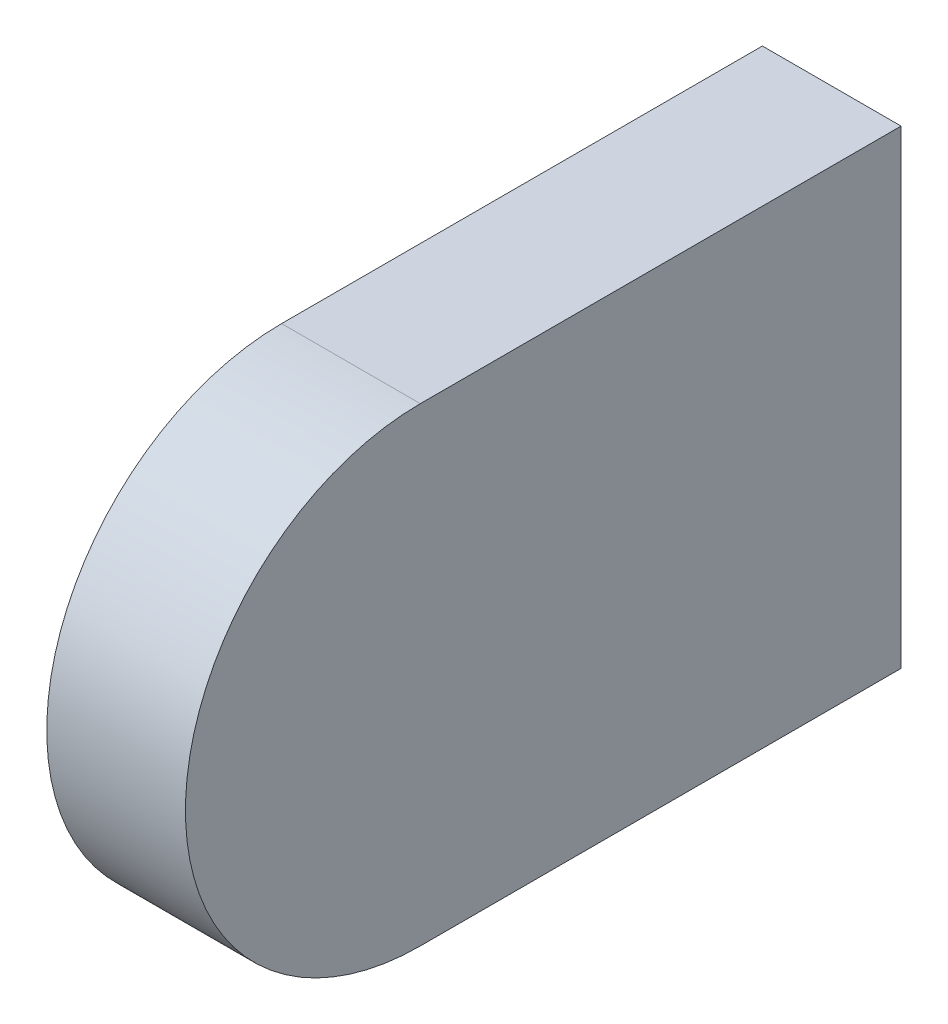
ISO-10303-21;
HEADER;
FILE_DESCRIPTION(('STEP AP214'),'2;1');
FILE_NAME('part.step','',(''),(''),'','','');
FILE_SCHEMA(('AUTOMOTIVE_DESIGN { 1 0 10303 214 1 1 1 1 }'));
ENDSEC;
DATA;
#1=APPLICATION_CONTEXT('core data for automotive mechanical design processes');
#2=APPLICATION_PROTOCOL_DEFINITION('international standard','automotive_design',2000,#1);
#3=PRODUCT_CONTEXT('',#1,'mechanical');
#4=PRODUCT('Part','Part','',(#3));
#5=PRODUCT_RELATED_PRODUCT_CATEGORY('part','',(#4));
#6=PRODUCT_DEFINITION_FORMATION('','',#4);
#7=PRODUCT_DEFINITION_CONTEXT('part definition',#1,'design');
#8=PRODUCT_DEFINITION('design','',#6,#7);
#9=PRODUCT_DEFINITION_SHAPE('','',#8);
#10=(LENGTH_UNIT() NAMED_UNIT(*) SI_UNIT(.MILLI.,.METRE.));
#11=(NAMED_UNIT(*) PLANE_ANGLE_UNIT() SI_UNIT($,.RADIAN.));
#12=(NAMED_UNIT(*) SI_UNIT($,.STERADIAN.) SOLID_ANGLE_UNIT());
#13=UNCERTAINTY_MEASURE_WITH_UNIT(LENGTH_MEASURE(1.E-05),#10,'distance_accuracy_value','');
#14=(GEOMETRIC_REPRESENTATION_CONTEXT(3) GLOBAL_UNCERTAINTY_ASSIGNED_CONTEXT((#13)) GLOBAL_UNIT_ASSIGNED_CONTEXT((#10,
#11,#12)) REPRESENTATION_CONTEXT('',''));
#15=CARTESIAN_POINT('',(0.,0.,0.));
#16=DIRECTION('',(0.,0.,1.));
#17=DIRECTION('',(1.,0.,0.));
#18=AXIS2_PLACEMENT_3D('',#15,#16,#17);
#19=CARTESIAN_POINT('',(75.,127.,0.));
#20=DIRECTION('',(0.,1.,0.));
#21=DIRECTION('',(0.,0.,1.));
#22=AXIS2_PLACEMENT_3D('',#19,#20,#21);
#23=PLANE('',#22);
#24=DIRECTION('',(0.,0.,-1.));
#25=VECTOR('',#24,1.);
#26=CARTESIAN_POINT('',(0.,127.,0.));
#27=LINE('',#26,#25);
#28=CARTESIAN_POINT('',(0.,127.,0.));
#29=VERTEX_POINT('',#28);
#30=CARTESIAN_POINT('',(0.,127.,-260.));
#31=VERTEX_POINT('',#30);
#32=EDGE_CURVE('E116',#29,#31,#27,.T.);
#33=ORIENTED_EDGE('',*,*,#32,.F.);
#34=DIRECTION('',(-1.,0.,0.));
#35=VECTOR('',#34,1.);
#36=CARTESIAN_POINT('',(75.,127.,0.));
#37=LINE('',#36,#35);
#38=CARTESIAN_POINT('',(75.,127.,0.));
#39=VERTEX_POINT('',#38);
#40=EDGE_CURVE('E11',#39,#29,#37,.T.);
#41=ORIENTED_EDGE('',*,*,#40,.F.);
#42=DIRECTION('',(0.,0.,-1.));
#43=VECTOR('',#42,1.);
#44=CARTESIAN_POINT('',(75.,127.,0.));
#45=LINE('',#44,#43);
#46=CARTESIAN_POINT('',(75.,127.,-260.));
#47=VERTEX_POINT('',#46);
#48=EDGE_CURVE('E109',#39,#47,#45,.T.);
#49=ORIENTED_EDGE('',*,*,#48,.T.);
#50=DIRECTION('',(-1.,0.,0.));
#51=VECTOR('',#50,1.);
#52=CARTESIAN_POINT('',(75.,127.,-260.));
#53=LINE('',#52,#51);
#54=EDGE_CURVE('E48',#47,#31,#53,.T.);
#55=ORIENTED_EDGE('',*,*,#54,.T.);
#56=EDGE_LOOP('',(#33,#41,#49,#55));
#57=FACE_BOUND('',#56,.T.);
#58=ADVANCED_FACE('F45',(#57),#23,.T.);
#59=CARTESIAN_POINT('',(75.,0.,0.));
#60=DIRECTION('',(-1.,0.,0.));
#61=DIRECTION('',(0.,0.,1.));
#62=AXIS2_PLACEMENT_3D('',#59,#60,#61);
#63=CYLINDRICAL_SURFACE('',#62,127.);
#64=CARTESIAN_POINT('',(0.,0.,0.));
#65=DIRECTION('',(1.,0.,0.));
#66=DIRECTION('',(0.,0.,-1.));
#67=AXIS2_PLACEMENT_3D('',#64,#65,#66);
#68=CIRCLE('',#67,127.);
#69=CARTESIAN_POINT('',(0.,-127.,0.));
#70=VERTEX_POINT('',#69);
#71=EDGE_CURVE('E79',#29,#70,#68,.T.);
#72=ORIENTED_EDGE('',*,*,#71,.T.);
#73=DIRECTION('',(-1.,0.,0.));
#74=VECTOR('',#73,1.);
#75=CARTESIAN_POINT('',(75.,-127.,0.));
#76=LINE('',#75,#74);
#77=CARTESIAN_POINT('',(75.,-127.,0.));
#78=VERTEX_POINT('',#77);
#79=EDGE_CURVE('E55',#78,#70,#76,.T.);
#80=ORIENTED_EDGE('',*,*,#79,.F.);
#81=CARTESIAN_POINT('',(75.,0.,0.));
#82=DIRECTION('',(1.,0.,0.));
#83=DIRECTION('',(0.,0.,-1.));
#84=AXIS2_PLACEMENT_3D('',#81,#82,#83);
#85=CIRCLE('',#84,127.);
#86=EDGE_CURVE('E94',#39,#78,#85,.T.);
#87=ORIENTED_EDGE('',*,*,#86,.F.);
#88=ORIENTED_EDGE('',*,*,#40,.T.);
#89=EDGE_LOOP('',(#72,#80,#87,#88));
#90=FACE_BOUND('',#89,.T.);
#91=ADVANCED_FACE('F132',(#90),#63,.T.);
#92=CARTESIAN_POINT('',(75.,-127.,0.));
#93=DIRECTION('',(0.,1.,0.));
#94=DIRECTION('',(0.,0.,1.));
#95=AXIS2_PLACEMENT_3D('',#92,#93,#94);
#96=PLANE('',#95);
#97=DIRECTION('',(0.,0.,-1.));
#98=VECTOR('',#97,1.);
#99=CARTESIAN_POINT('',(0.,-127.,0.));
#100=LINE('',#99,#98);
#101=CARTESIAN_POINT('',(0.,-127.,-260.));
#102=VERTEX_POINT('',#101);
#103=EDGE_CURVE('E102',#70,#102,#100,.T.);
#104=ORIENTED_EDGE('',*,*,#103,.T.);
#105=DIRECTION('',(-1.,0.,0.));
#106=VECTOR('',#105,1.);
#107=CARTESIAN_POINT('',(75.,-127.,-260.));
#108=LINE('',#107,#106);
#109=CARTESIAN_POINT('',(75.,-127.,-260.));
#110=VERTEX_POINT('',#109);
#111=EDGE_CURVE('E99',#110,#102,#108,.T.);
#112=ORIENTED_EDGE('',*,*,#111,.F.);
#113=DIRECTION('',(0.,0.,-1.));
#114=VECTOR('',#113,1.);
#115=CARTESIAN_POINT('',(75.,-127.,0.));
#116=LINE('',#115,#114);
#117=EDGE_CURVE('E91',#78,#110,#116,.T.);
#118=ORIENTED_EDGE('',*,*,#117,.F.);
#119=ORIENTED_EDGE('',*,*,#79,.T.);
#120=EDGE_LOOP('',(#104,#112,#118,#119));
#121=FACE_BOUND('',#120,.T.);
#122=ADVANCED_FACE('F100',(#121),#96,.F.);
#123=CARTESIAN_POINT('',(75.,-127.,-260.));
#124=DIRECTION('',(0.,0.,1.));
#125=DIRECTION('',(1.,0.,0.));
#126=AXIS2_PLACEMENT_3D('',#123,#124,#125);
#127=PLANE('',#126);
#128=DIRECTION('',(0.,1.,0.));
#129=VECTOR('',#128,1.);
#130=CARTESIAN_POINT('',(0.,-127.,-260.));
#131=LINE('',#130,#129);
#132=EDGE_CURVE('E120',#102,#31,#131,.T.);
#133=ORIENTED_EDGE('',*,*,#132,.T.);
#134=ORIENTED_EDGE('',*,*,#54,.F.);
#135=DIRECTION('',(0.,1.,0.));
#136=VECTOR('',#135,1.);
#137=CARTESIAN_POINT('',(75.,-127.,-260.));
#138=LINE('',#137,#136);
#139=EDGE_CURVE('E88',#110,#47,#138,.T.);
#140=ORIENTED_EDGE('',*,*,#139,.F.);
#141=ORIENTED_EDGE('',*,*,#111,.T.);
#142=EDGE_LOOP('',(#133,#134,#140,#141));
#143=FACE_BOUND('',#142,.T.);
#144=ADVANCED_FACE('F107',(#143),#127,.F.);
#145=CARTESIAN_POINT('',(75.,0.,0.));
#146=DIRECTION('',(1.,0.,0.));
#147=DIRECTION('',(0.,0.,-1.));
#148=AXIS2_PLACEMENT_3D('',#145,#146,#147);
#149=PLANE('',#148);
#150=ORIENTED_EDGE('',*,*,#48,.F.);
#151=ORIENTED_EDGE('',*,*,#86,.T.);
#152=ORIENTED_EDGE('',*,*,#117,.T.);
#153=ORIENTED_EDGE('',*,*,#139,.T.);
#154=EDGE_LOOP('',(#150,#151,#152,#153));
#155=FACE_BOUND('',#154,.T.);
#156=ADVANCED_FACE('F93',(#155),#149,.T.);
#157=CARTESIAN_POINT('',(0.,0.,0.));
#158=DIRECTION('',(1.,0.,0.));
#159=DIRECTION('',(0.,0.,-1.));
#160=AXIS2_PLACEMENT_3D('',#157,#158,#159);
#161=PLANE('',#160);
#162=ORIENTED_EDGE('',*,*,#32,.T.);
#163=ORIENTED_EDGE('',*,*,#132,.F.);
#164=ORIENTED_EDGE('',*,*,#103,.F.);
#165=ORIENTED_EDGE('',*,*,#71,.F.);
#166=EDGE_LOOP('',(#162,#163,#164,#165));
#167=FACE_BOUND('',#166,.T.);
#168=ADVANCED_FACE('F129',(#167),#161,.F.);
#169=CLOSED_SHELL('',(#58,#91,#122,#144,#156,#168));
#170=MANIFOLD_SOLID_BREP('B2',#169);
#171=ADVANCED_BREP_SHAPE_REPRESENTATION('',(#18,#170),#14);
#172=SHAPE_DEFINITION_REPRESENTATION(#9,#171);
ENDSEC;
END-ISO-10303-21;
